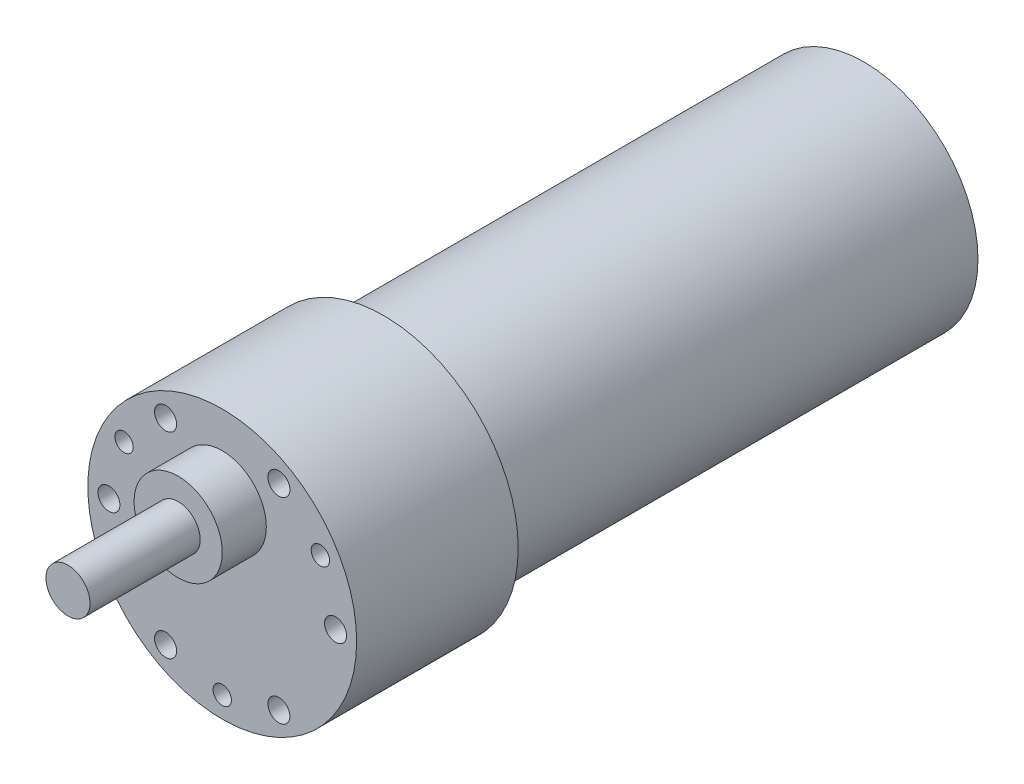
ISO-10303-21;
HEADER;
FILE_DESCRIPTION(('STEP AP214'),'2;1');
FILE_NAME('part.step','',(''),(''),'','','');
FILE_SCHEMA(('AUTOMOTIVE_DESIGN { 1 0 10303 214 1 1 1 1 }'));
ENDSEC;
DATA;
#1=APPLICATION_CONTEXT('core data for automotive mechanical design processes');
#2=APPLICATION_PROTOCOL_DEFINITION('international standard','automotive_design',2000,#1);
#3=PRODUCT_CONTEXT('',#1,'mechanical');
#4=PRODUCT('Part','Part','',(#3));
#5=PRODUCT_RELATED_PRODUCT_CATEGORY('part','',(#4));
#6=PRODUCT_DEFINITION_FORMATION('','',#4);
#7=PRODUCT_DEFINITION_CONTEXT('part definition',#1,'design');
#8=PRODUCT_DEFINITION('design','',#6,#7);
#9=PRODUCT_DEFINITION_SHAPE('','',#8);
#10=(LENGTH_UNIT() NAMED_UNIT(*) SI_UNIT(.MILLI.,.METRE.));
#11=(NAMED_UNIT(*) PLANE_ANGLE_UNIT() SI_UNIT($,.RADIAN.));
#12=(NAMED_UNIT(*) SI_UNIT($,.STERADIAN.) SOLID_ANGLE_UNIT());
#13=UNCERTAINTY_MEASURE_WITH_UNIT(LENGTH_MEASURE(1.E-05),#10,'distance_accuracy_value','');
#14=(GEOMETRIC_REPRESENTATION_CONTEXT(3) GLOBAL_UNCERTAINTY_ASSIGNED_CONTEXT((#13)) GLOBAL_UNIT_ASSIGNED_CONTEXT((#10,
#11,#12)) REPRESENTATION_CONTEXT('',''));
#15=CARTESIAN_POINT('',(0.,0.,0.));
#16=DIRECTION('',(0.,0.,1.));
#17=DIRECTION('',(1.,0.,0.));
#18=AXIS2_PLACEMENT_3D('',#15,#16,#17);
#19=CARTESIAN_POINT('',(0.,0.,65.4));
#20=DIRECTION('',(0.,0.,-1.));
#21=DIRECTION('',(-1.,0.,0.));
#22=AXIS2_PLACEMENT_3D('',#19,#20,#21);
#23=CYLINDRICAL_SURFACE('',#22,15.5);
#24=CARTESIAN_POINT('',(0.,0.,65.4));
#25=DIRECTION('',(0.,0.,1.));
#26=DIRECTION('',(1.,0.,0.));
#27=AXIS2_PLACEMENT_3D('',#24,#25,#26);
#28=CIRCLE('',#27,15.5);
#29=CARTESIAN_POINT('',(15.5,0.,65.4));
#30=VERTEX_POINT('',#29);
#31=EDGE_CURVE('E51',#30,#30,#28,.T.);
#32=ORIENTED_EDGE('',*,*,#31,.F.);
#33=EDGE_LOOP('',(#32));
#34=FACE_BOUND('',#33,.T.);
#35=CARTESIAN_POINT('',(0.,0.,0.));
#36=DIRECTION('',(0.,0.,1.));
#37=DIRECTION('',(1.,0.,0.));
#38=AXIS2_PLACEMENT_3D('',#35,#36,#37);
#39=CIRCLE('',#38,15.5);
#40=CARTESIAN_POINT('',(15.5,0.,0.));
#41=VERTEX_POINT('',#40);
#42=EDGE_CURVE('E40',#41,#41,#39,.T.);
#43=ORIENTED_EDGE('',*,*,#42,.T.);
#44=EDGE_LOOP('',(#43));
#45=FACE_BOUND('',#44,.T.);
#46=ADVANCED_FACE('F37',(#34,#45),#23,.T.);
#47=CARTESIAN_POINT('',(0.,0.,0.));
#48=DIRECTION('',(0.,0.,1.));
#49=DIRECTION('',(1.,0.,0.));
#50=AXIS2_PLACEMENT_3D('',#47,#48,#49);
#51=PLANE('',#50);
#52=CARTESIAN_POINT('',(0.,0.,0.));
#53=DIRECTION('',(0.,0.,-1.));
#54=DIRECTION('',(-1.,0.,0.));
#55=AXIS2_PLACEMENT_3D('',#52,#53,#54);
#56=CIRCLE('',#55,6.);
#57=CARTESIAN_POINT('',(-6.,0.,0.));
#58=VERTEX_POINT('',#57);
#59=EDGE_CURVE('E45',#58,#58,#56,.T.);
#60=ORIENTED_EDGE('',*,*,#59,.F.);
#61=EDGE_LOOP('',(#60));
#62=FACE_BOUND('',#61,.T.);
#63=ORIENTED_EDGE('',*,*,#42,.F.);
#64=EDGE_LOOP('',(#63));
#65=FACE_BOUND('',#64,.T.);
#66=ADVANCED_FACE('F156',(#62,#65),#51,.F.);
#67=CARTESIAN_POINT('',(0.,0.,-2.));
#68=DIRECTION('',(0.,0.,1.));
#69=DIRECTION('',(1.,0.,0.));
#70=AXIS2_PLACEMENT_3D('',#67,#68,#69);
#71=CYLINDRICAL_SURFACE('',#70,6.);
#72=CARTESIAN_POINT('',(0.,0.,-2.));
#73=DIRECTION('',(0.,0.,-1.));
#74=DIRECTION('',(-1.,0.,0.));
#75=AXIS2_PLACEMENT_3D('',#72,#73,#74);
#76=CIRCLE('',#75,6.);
#77=CARTESIAN_POINT('',(-6.,0.,-2.));
#78=VERTEX_POINT('',#77);
#79=EDGE_CURVE('E141',#78,#78,#76,.T.);
#80=ORIENTED_EDGE('',*,*,#79,.F.);
#81=EDGE_LOOP('',(#80));
#82=FACE_BOUND('',#81,.T.);
#83=ORIENTED_EDGE('',*,*,#59,.T.);
#84=EDGE_LOOP('',(#83));
#85=FACE_BOUND('',#84,.T.);
#86=ADVANCED_FACE('F158',(#82,#85),#71,.T.);
#87=CARTESIAN_POINT('',(0.,0.,-2.));
#88=DIRECTION('',(0.,0.,-1.));
#89=DIRECTION('',(-1.,0.,0.));
#90=AXIS2_PLACEMENT_3D('',#87,#88,#89);
#91=PLANE('',#90);
#92=ORIENTED_EDGE('',*,*,#79,.T.);
#93=EDGE_LOOP('',(#92));
#94=FACE_BOUND('',#93,.T.);
#95=ADVANCED_FACE('F164',(#94),#91,.T.);
#96=CARTESIAN_POINT('',(0.,0.,87.4));
#97=DIRECTION('',(0.,0.,-1.));
#98=DIRECTION('',(-1.,0.,0.));
#99=AXIS2_PLACEMENT_3D('',#96,#97,#98);
#100=CYLINDRICAL_SURFACE('',#99,18.3);
#101=CARTESIAN_POINT('',(0.,0.,87.4));
#102=DIRECTION('',(0.,0.,1.));
#103=DIRECTION('',(1.,0.,0.));
#104=AXIS2_PLACEMENT_3D('',#101,#102,#103);
#105=CIRCLE('',#104,18.3);
#106=CARTESIAN_POINT('',(18.3,0.,87.4));
#107=VERTEX_POINT('',#106);
#108=EDGE_CURVE('E137',#107,#107,#105,.T.);
#109=ORIENTED_EDGE('',*,*,#108,.F.);
#110=EDGE_LOOP('',(#109));
#111=FACE_BOUND('',#110,.T.);
#112=CARTESIAN_POINT('',(0.,0.,65.4));
#113=DIRECTION('',(0.,0.,1.));
#114=DIRECTION('',(1.,0.,0.));
#115=AXIS2_PLACEMENT_3D('',#112,#113,#114);
#116=CIRCLE('',#115,18.3);
#117=CARTESIAN_POINT('',(18.3,0.,65.4));
#118=VERTEX_POINT('',#117);
#119=EDGE_CURVE('E93',#118,#118,#116,.T.);
#120=ORIENTED_EDGE('',*,*,#119,.T.);
#121=EDGE_LOOP('',(#120));
#122=FACE_BOUND('',#121,.T.);
#123=ADVANCED_FACE('F172',(#111,#122),#100,.T.);
#124=CARTESIAN_POINT('',(0.,0.,87.4));
#125=DIRECTION('',(0.,0.,1.));
#126=DIRECTION('',(1.,0.,0.));
#127=AXIS2_PLACEMENT_3D('',#124,#125,#126);
#128=PLANE('',#127);
#129=CARTESIAN_POINT('',(0.,7.37,87.4));
#130=DIRECTION('',(0.,0.,1.));
#131=DIRECTION('',(1.,0.,0.));
#132=AXIS2_PLACEMENT_3D('',#129,#130,#131);
#133=CIRCLE('',#132,6.);
#134=CARTESIAN_POINT('',(6.,7.37,87.4));
#135=VERTEX_POINT('',#134);
#136=EDGE_CURVE('E61',#135,#135,#133,.T.);
#137=ORIENTED_EDGE('',*,*,#136,.F.);
#138=EDGE_LOOP('',(#137));
#139=FACE_BOUND('',#138,.T.);
#140=CARTESIAN_POINT('',(0.,-15.43,87.4));
#141=DIRECTION('',(0.,0.,1.));
#142=DIRECTION('',(1.,0.,0.));
#143=AXIS2_PLACEMENT_3D('',#140,#141,#142);
#144=CIRCLE('',#143,1.25);
#145=CARTESIAN_POINT('',(1.25,-15.43,87.4));
#146=VERTEX_POINT('',#145);
#147=EDGE_CURVE('E70',#146,#146,#144,.T.);
#148=ORIENTED_EDGE('',*,*,#147,.F.);
#149=EDGE_LOOP('',(#148));
#150=FACE_BOUND('',#149,.T.);
#151=CARTESIAN_POINT('',(-13.3627719803939,7.71500000000007,87.4));
#152=DIRECTION('',(0.,0.,1.));
#153=DIRECTION('',(1.,0.,0.));
#154=AXIS2_PLACEMENT_3D('',#151,#152,#153);
#155=CIRCLE('',#154,1.25);
#156=CARTESIAN_POINT('',(-12.1127719803939,7.71500000000007,87.4));
#157=VERTEX_POINT('',#156);
#158=EDGE_CURVE('E74',#157,#157,#155,.T.);
#159=ORIENTED_EDGE('',*,*,#158,.F.);
#160=EDGE_LOOP('',(#159));
#161=FACE_BOUND('',#160,.T.);
#162=CARTESIAN_POINT('',(13.362771980394,7.71499999999988,87.4));
#163=DIRECTION('',(0.,0.,1.));
#164=DIRECTION('',(1.,0.,0.));
#165=AXIS2_PLACEMENT_3D('',#162,#163,#164);
#166=CIRCLE('',#165,1.25);
#167=CARTESIAN_POINT('',(14.612771980394,7.71499999999988,87.4));
#168=VERTEX_POINT('',#167);
#169=EDGE_CURVE('E82',#168,#168,#166,.T.);
#170=ORIENTED_EDGE('',*,*,#169,.F.);
#171=EDGE_LOOP('',(#170));
#172=FACE_BOUND('',#171,.T.);
#173=CARTESIAN_POINT('',(-15.43,0.,87.4));
#174=DIRECTION('',(0.,0.,1.));
#175=DIRECTION('',(1.,0.,0.));
#176=AXIS2_PLACEMENT_3D('',#173,#174,#175);
#177=CIRCLE('',#176,1.5);
#178=CARTESIAN_POINT('',(-13.93,0.,87.4));
#179=VERTEX_POINT('',#178);
#180=EDGE_CURVE('E94',#179,#179,#177,.T.);
#181=ORIENTED_EDGE('',*,*,#180,.F.);
#182=EDGE_LOOP('',(#181));
#183=FACE_BOUND('',#182,.T.);
#184=CARTESIAN_POINT('',(7.71499999999988,-13.362771980394,87.4));
#185=DIRECTION('',(0.,0.,1.));
#186=DIRECTION('',(1.,0.,0.));
#187=AXIS2_PLACEMENT_3D('',#184,#185,#186);
#188=CIRCLE('',#187,1.5);
#189=CARTESIAN_POINT('',(9.21499999999988,-13.362771980394,87.4));
#190=VERTEX_POINT('',#189);
#191=EDGE_CURVE('E69',#190,#190,#188,.T.);
#192=ORIENTED_EDGE('',*,*,#191,.F.);
#193=EDGE_LOOP('',(#192));
#194=FACE_BOUND('',#193,.T.);
#195=CARTESIAN_POINT('',(-7.71500000000016,-13.3627719803938,87.4));
#196=DIRECTION('',(0.,0.,1.));
#197=DIRECTION('',(1.,0.,0.));
#198=AXIS2_PLACEMENT_3D('',#195,#196,#197);
#199=CIRCLE('',#198,1.5);
#200=CARTESIAN_POINT('',(-6.21500000000016,-13.3627719803938,87.4));
#201=VERTEX_POINT('',#200);
#202=EDGE_CURVE('E103',#201,#201,#199,.T.);
#203=ORIENTED_EDGE('',*,*,#202,.F.);
#204=EDGE_LOOP('',(#203));
#205=FACE_BOUND('',#204,.T.);
#206=CARTESIAN_POINT('',(15.43,-1.07747114116699E-13,87.4));
#207=DIRECTION('',(0.,0.,1.));
#208=DIRECTION('',(1.,0.,0.));
#209=AXIS2_PLACEMENT_3D('',#206,#207,#208);
#210=CIRCLE('',#209,1.5);
#211=CARTESIAN_POINT('',(16.93,-1.07747114116699E-13,87.4));
#212=VERTEX_POINT('',#211);
#213=EDGE_CURVE('E126',#212,#212,#210,.T.);
#214=ORIENTED_EDGE('',*,*,#213,.F.);
#215=EDGE_LOOP('',(#214));
#216=FACE_BOUND('',#215,.T.);
#217=CARTESIAN_POINT('',(7.71500000000006,13.3627719803939,87.4));
#218=DIRECTION('',(0.,0.,1.));
#219=DIRECTION('',(1.,0.,0.));
#220=AXIS2_PLACEMENT_3D('',#217,#218,#219);
#221=CIRCLE('',#220,1.5);
#222=CARTESIAN_POINT('',(9.21500000000006,13.3627719803939,87.4));
#223=VERTEX_POINT('',#222);
#224=EDGE_CURVE('E118',#223,#223,#221,.T.);
#225=ORIENTED_EDGE('',*,*,#224,.F.);
#226=EDGE_LOOP('',(#225));
#227=FACE_BOUND('',#226,.T.);
#228=CARTESIAN_POINT('',(-7.71499999999997,13.3627719803939,87.4));
#229=DIRECTION('',(0.,0.,1.));
#230=DIRECTION('',(1.,0.,0.));
#231=AXIS2_PLACEMENT_3D('',#228,#229,#230);
#232=CIRCLE('',#231,1.5);
#233=CARTESIAN_POINT('',(-6.21499999999997,13.3627719803939,87.4));
#234=VERTEX_POINT('',#233);
#235=EDGE_CURVE('E110',#234,#234,#232,.T.);
#236=ORIENTED_EDGE('',*,*,#235,.F.);
#237=EDGE_LOOP('',(#236));
#238=FACE_BOUND('',#237,.T.);
#239=ORIENTED_EDGE('',*,*,#108,.T.);
#240=EDGE_LOOP('',(#239));
#241=FACE_BOUND('',#240,.T.);
#242=ADVANCED_FACE('F176',(#139,#150,#161,#172,#183,#194,#205,#216,#227,#238,#241),#128,.T.);
#243=CARTESIAN_POINT('',(0.,0.,65.4));
#244=DIRECTION('',(0.,0.,1.));
#245=DIRECTION('',(1.,0.,0.));
#246=AXIS2_PLACEMENT_3D('',#243,#244,#245);
#247=PLANE('',#246);
#248=ORIENTED_EDGE('',*,*,#31,.T.);
#249=EDGE_LOOP('',(#248));
#250=FACE_BOUND('',#249,.T.);
#251=ORIENTED_EDGE('',*,*,#119,.F.);
#252=EDGE_LOOP('',(#251));
#253=FACE_BOUND('',#252,.T.);
#254=ADVANCED_FACE('F178',(#250,#253),#247,.F.);
#255=CARTESIAN_POINT('',(-7.71499999999997,13.3627719803939,67.4));
#256=DIRECTION('',(0.,0.,1.));
#257=DIRECTION('',(1.,0.,0.));
#258=AXIS2_PLACEMENT_3D('',#255,#256,#257);
#259=CYLINDRICAL_SURFACE('',#258,1.5);
#260=CARTESIAN_POINT('',(-7.71499999999997,13.3627719803939,67.4));
#261=DIRECTION('',(0.,0.,1.));
#262=DIRECTION('',(1.,0.,0.));
#263=AXIS2_PLACEMENT_3D('',#260,#261,#262);
#264=CIRCLE('',#263,1.5);
#265=CARTESIAN_POINT('',(-6.21499999999997,13.3627719803939,67.4));
#266=VERTEX_POINT('',#265);
#267=EDGE_CURVE('E98',#266,#266,#264,.T.);
#268=ORIENTED_EDGE('',*,*,#267,.F.);
#269=EDGE_LOOP('',(#268));
#270=FACE_BOUND('',#269,.T.);
#271=ORIENTED_EDGE('',*,*,#235,.T.);
#272=EDGE_LOOP('',(#271));
#273=FACE_BOUND('',#272,.T.);
#274=ADVANCED_FACE('F181',(#270,#273),#259,.F.);
#275=CARTESIAN_POINT('',(0.,0.,67.4));
#276=DIRECTION('',(0.,0.,1.));
#277=DIRECTION('',(1.,0.,0.));
#278=AXIS2_PLACEMENT_3D('',#275,#276,#277);
#279=PLANE('',#278);
#280=ORIENTED_EDGE('',*,*,#267,.T.);
#281=EDGE_LOOP('',(#280));
#282=FACE_BOUND('',#281,.T.);
#283=ADVANCED_FACE('F206',(#282),#279,.T.);
#284=CARTESIAN_POINT('',(7.71500000000006,13.3627719803939,67.4));
#285=DIRECTION('',(0.,0.,1.));
#286=DIRECTION('',(1.,0.,0.));
#287=AXIS2_PLACEMENT_3D('',#284,#285,#286);
#288=CYLINDRICAL_SURFACE('',#287,1.5);
#289=CARTESIAN_POINT('',(7.71500000000006,13.3627719803939,67.4));
#290=DIRECTION('',(0.,0.,1.));
#291=DIRECTION('',(1.,0.,0.));
#292=AXIS2_PLACEMENT_3D('',#289,#290,#291);
#293=CIRCLE('',#292,1.5);
#294=CARTESIAN_POINT('',(9.21500000000006,13.3627719803939,67.4));
#295=VERTEX_POINT('',#294);
#296=EDGE_CURVE('E114',#295,#295,#293,.T.);
#297=ORIENTED_EDGE('',*,*,#296,.F.);
#298=EDGE_LOOP('',(#297));
#299=FACE_BOUND('',#298,.T.);
#300=ORIENTED_EDGE('',*,*,#224,.T.);
#301=EDGE_LOOP('',(#300));
#302=FACE_BOUND('',#301,.T.);
#303=ADVANCED_FACE('F203',(#299,#302),#288,.F.);
#304=CARTESIAN_POINT('',(0.,0.,67.4));
#305=DIRECTION('',(0.,0.,1.));
#306=DIRECTION('',(1.,0.,0.));
#307=AXIS2_PLACEMENT_3D('',#304,#305,#306);
#308=PLANE('',#307);
#309=ORIENTED_EDGE('',*,*,#296,.T.);
#310=EDGE_LOOP('',(#309));
#311=FACE_BOUND('',#310,.T.);
#312=ADVANCED_FACE('F198',(#311),#308,.T.);
#313=CARTESIAN_POINT('',(15.43,-1.07747114116699E-13,67.4));
#314=DIRECTION('',(0.,0.,1.));
#315=DIRECTION('',(1.,0.,0.));
#316=AXIS2_PLACEMENT_3D('',#313,#314,#315);
#317=CYLINDRICAL_SURFACE('',#316,1.5);
#318=CARTESIAN_POINT('',(15.43,-1.07747114116699E-13,67.4));
#319=DIRECTION('',(0.,0.,1.));
#320=DIRECTION('',(1.,0.,0.));
#321=AXIS2_PLACEMENT_3D('',#318,#319,#320);
#322=CIRCLE('',#321,1.5);
#323=CARTESIAN_POINT('',(16.93,-1.07747114116699E-13,67.4));
#324=VERTEX_POINT('',#323);
#325=EDGE_CURVE('E122',#324,#324,#322,.T.);
#326=ORIENTED_EDGE('',*,*,#325,.F.);
#327=EDGE_LOOP('',(#326));
#328=FACE_BOUND('',#327,.T.);
#329=ORIENTED_EDGE('',*,*,#213,.T.);
#330=EDGE_LOOP('',(#329));
#331=FACE_BOUND('',#330,.T.);
#332=ADVANCED_FACE('F195',(#328,#331),#317,.F.);
#333=CARTESIAN_POINT('',(0.,0.,67.4));
#334=DIRECTION('',(0.,0.,1.));
#335=DIRECTION('',(1.,0.,0.));
#336=AXIS2_PLACEMENT_3D('',#333,#334,#335);
#337=PLANE('',#336);
#338=ORIENTED_EDGE('',*,*,#325,.T.);
#339=EDGE_LOOP('',(#338));
#340=FACE_BOUND('',#339,.T.);
#341=ADVANCED_FACE('F189',(#340),#337,.T.);
#342=CARTESIAN_POINT('',(-7.71500000000016,-13.3627719803938,67.4));
#343=DIRECTION('',(0.,0.,1.));
#344=DIRECTION('',(1.,0.,0.));
#345=AXIS2_PLACEMENT_3D('',#342,#343,#344);
#346=CYLINDRICAL_SURFACE('',#345,1.5);
#347=CARTESIAN_POINT('',(-7.71500000000016,-13.3627719803938,67.4));
#348=DIRECTION('',(0.,0.,1.));
#349=DIRECTION('',(1.,0.,0.));
#350=AXIS2_PLACEMENT_3D('',#347,#348,#349);
#351=CIRCLE('',#350,1.5);
#352=CARTESIAN_POINT('',(-6.21500000000016,-13.3627719803938,67.4));
#353=VERTEX_POINT('',#352);
#354=EDGE_CURVE('E130',#353,#353,#351,.T.);
#355=ORIENTED_EDGE('',*,*,#354,.F.);
#356=EDGE_LOOP('',(#355));
#357=FACE_BOUND('',#356,.T.);
#358=ORIENTED_EDGE('',*,*,#202,.T.);
#359=EDGE_LOOP('',(#358));
#360=FACE_BOUND('',#359,.T.);
#361=ADVANCED_FACE('F185',(#357,#360),#346,.F.);
#362=CARTESIAN_POINT('',(0.,0.,67.4));
#363=DIRECTION('',(0.,0.,1.));
#364=DIRECTION('',(1.,0.,0.));
#365=AXIS2_PLACEMENT_3D('',#362,#363,#364);
#366=PLANE('',#365);
#367=ORIENTED_EDGE('',*,*,#354,.T.);
#368=EDGE_LOOP('',(#367));
#369=FACE_BOUND('',#368,.T.);
#370=ADVANCED_FACE('F188',(#369),#366,.T.);
#371=CARTESIAN_POINT('',(7.71499999999988,-13.362771980394,67.4));
#372=DIRECTION('',(0.,0.,1.));
#373=DIRECTION('',(1.,0.,0.));
#374=AXIS2_PLACEMENT_3D('',#371,#372,#373);
#375=CYLINDRICAL_SURFACE('',#374,1.5);
#376=CARTESIAN_POINT('',(7.71499999999988,-13.362771980394,67.4));
#377=DIRECTION('',(0.,0.,1.));
#378=DIRECTION('',(1.,0.,0.));
#379=AXIS2_PLACEMENT_3D('',#376,#377,#378);
#380=CIRCLE('',#379,1.5);
#381=CARTESIAN_POINT('',(9.21499999999988,-13.362771980394,67.4));
#382=VERTEX_POINT('',#381);
#383=EDGE_CURVE('E99',#382,#382,#380,.T.);
#384=ORIENTED_EDGE('',*,*,#383,.F.);
#385=EDGE_LOOP('',(#384));
#386=FACE_BOUND('',#385,.T.);
#387=ORIENTED_EDGE('',*,*,#191,.T.);
#388=EDGE_LOOP('',(#387));
#389=FACE_BOUND('',#388,.T.);
#390=ADVANCED_FACE('F193',(#386,#389),#375,.F.);
#391=CARTESIAN_POINT('',(0.,0.,67.4));
#392=DIRECTION('',(0.,0.,1.));
#393=DIRECTION('',(1.,0.,0.));
#394=AXIS2_PLACEMENT_3D('',#391,#392,#393);
#395=PLANE('',#394);
#396=ORIENTED_EDGE('',*,*,#383,.T.);
#397=EDGE_LOOP('',(#396));
#398=FACE_BOUND('',#397,.T.);
#399=ADVANCED_FACE('F219',(#398),#395,.T.);
#400=CARTESIAN_POINT('',(-15.43,0.,67.4));
#401=DIRECTION('',(0.,0.,1.));
#402=DIRECTION('',(1.,0.,0.));
#403=AXIS2_PLACEMENT_3D('',#400,#401,#402);
#404=CYLINDRICAL_SURFACE('',#403,1.5);
#405=CARTESIAN_POINT('',(-15.43,0.,67.4));
#406=DIRECTION('',(0.,0.,1.));
#407=DIRECTION('',(1.,0.,0.));
#408=AXIS2_PLACEMENT_3D('',#405,#406,#407);
#409=CIRCLE('',#408,1.5);
#410=CARTESIAN_POINT('',(-13.93,0.,67.4));
#411=VERTEX_POINT('',#410);
#412=EDGE_CURVE('E89',#411,#411,#409,.T.);
#413=ORIENTED_EDGE('',*,*,#412,.F.);
#414=EDGE_LOOP('',(#413));
#415=FACE_BOUND('',#414,.T.);
#416=ORIENTED_EDGE('',*,*,#180,.T.);
#417=EDGE_LOOP('',(#416));
#418=FACE_BOUND('',#417,.T.);
#419=ADVANCED_FACE('F223',(#415,#418),#404,.F.);
#420=CARTESIAN_POINT('',(0.,0.,67.4));
#421=DIRECTION('',(0.,0.,1.));
#422=DIRECTION('',(1.,0.,0.));
#423=AXIS2_PLACEMENT_3D('',#420,#421,#422);
#424=PLANE('',#423);
#425=ORIENTED_EDGE('',*,*,#412,.T.);
#426=EDGE_LOOP('',(#425));
#427=FACE_BOUND('',#426,.T.);
#428=ADVANCED_FACE('F227',(#427),#424,.T.);
#429=CARTESIAN_POINT('',(13.362771980394,7.71499999999988,67.4));
#430=DIRECTION('',(0.,0.,1.));
#431=DIRECTION('',(1.,0.,0.));
#432=AXIS2_PLACEMENT_3D('',#429,#430,#431);
#433=CYLINDRICAL_SURFACE('',#432,1.25);
#434=CARTESIAN_POINT('',(13.362771980394,7.71499999999988,67.4));
#435=DIRECTION('',(0.,0.,1.));
#436=DIRECTION('',(1.,0.,0.));
#437=AXIS2_PLACEMENT_3D('',#434,#435,#436);
#438=CIRCLE('',#437,1.25);
#439=CARTESIAN_POINT('',(14.612771980394,7.71499999999988,67.4));
#440=VERTEX_POINT('',#439);
#441=EDGE_CURVE('E60',#440,#440,#438,.T.);
#442=ORIENTED_EDGE('',*,*,#441,.F.);
#443=EDGE_LOOP('',(#442));
#444=FACE_BOUND('',#443,.T.);
#445=ORIENTED_EDGE('',*,*,#169,.T.);
#446=EDGE_LOOP('',(#445));
#447=FACE_BOUND('',#446,.T.);
#448=ADVANCED_FACE('F231',(#444,#447),#433,.F.);
#449=CARTESIAN_POINT('',(13.362771980394,7.71499999999988,67.4));
#450=DIRECTION('',(0.,0.,1.));
#451=DIRECTION('',(1.,0.,0.));
#452=AXIS2_PLACEMENT_3D('',#449,#450,#451);
#453=PLANE('',#452);
#454=ORIENTED_EDGE('',*,*,#441,.T.);
#455=EDGE_LOOP('',(#454));
#456=FACE_BOUND('',#455,.T.);
#457=ADVANCED_FACE('F233',(#456),#453,.T.);
#458=CARTESIAN_POINT('',(-13.3627719803939,7.71500000000007,67.4));
#459=DIRECTION('',(0.,0.,1.));
#460=DIRECTION('',(1.,0.,0.));
#461=AXIS2_PLACEMENT_3D('',#458,#459,#460);
#462=CYLINDRICAL_SURFACE('',#461,1.25);
#463=CARTESIAN_POINT('',(-13.3627719803939,7.71500000000007,67.4));
#464=DIRECTION('',(0.,0.,1.));
#465=DIRECTION('',(1.,0.,0.));
#466=AXIS2_PLACEMENT_3D('',#463,#464,#465);
#467=CIRCLE('',#466,1.25);
#468=CARTESIAN_POINT('',(-12.1127719803939,7.71500000000007,67.4));
#469=VERTEX_POINT('',#468);
#470=EDGE_CURVE('E78',#469,#469,#467,.T.);
#471=ORIENTED_EDGE('',*,*,#470,.F.);
#472=EDGE_LOOP('',(#471));
#473=FACE_BOUND('',#472,.T.);
#474=ORIENTED_EDGE('',*,*,#158,.T.);
#475=EDGE_LOOP('',(#474));
#476=FACE_BOUND('',#475,.T.);
#477=ADVANCED_FACE('F236',(#473,#476),#462,.F.);
#478=CARTESIAN_POINT('',(-13.3627719803939,7.71500000000007,67.4));
#479=DIRECTION('',(0.,0.,1.));
#480=DIRECTION('',(1.,0.,0.));
#481=AXIS2_PLACEMENT_3D('',#478,#479,#480);
#482=PLANE('',#481);
#483=ORIENTED_EDGE('',*,*,#470,.T.);
#484=EDGE_LOOP('',(#483));
#485=FACE_BOUND('',#484,.T.);
#486=ADVANCED_FACE('F241',(#485),#482,.T.);
#487=CARTESIAN_POINT('',(0.,-15.43,67.4));
#488=DIRECTION('',(0.,0.,1.));
#489=DIRECTION('',(1.,0.,0.));
#490=AXIS2_PLACEMENT_3D('',#487,#488,#489);
#491=CYLINDRICAL_SURFACE('',#490,1.25);
#492=CARTESIAN_POINT('',(0.,-15.43,67.4));
#493=DIRECTION('',(0.,0.,1.));
#494=DIRECTION('',(1.,0.,0.));
#495=AXIS2_PLACEMENT_3D('',#492,#493,#494);
#496=CIRCLE('',#495,1.25);
#497=CARTESIAN_POINT('',(1.25,-15.43,67.4));
#498=VERTEX_POINT('',#497);
#499=EDGE_CURVE('E65',#498,#498,#496,.T.);
#500=ORIENTED_EDGE('',*,*,#499,.F.);
#501=EDGE_LOOP('',(#500));
#502=FACE_BOUND('',#501,.T.);
#503=ORIENTED_EDGE('',*,*,#147,.T.);
#504=EDGE_LOOP('',(#503));
#505=FACE_BOUND('',#504,.T.);
#506=ADVANCED_FACE('F244',(#502,#505),#491,.F.);
#507=CARTESIAN_POINT('',(0.,-15.43,67.4));
#508=DIRECTION('',(0.,0.,1.));
#509=DIRECTION('',(1.,0.,0.));
#510=AXIS2_PLACEMENT_3D('',#507,#508,#509);
#511=PLANE('',#510);
#512=ORIENTED_EDGE('',*,*,#499,.T.);
#513=EDGE_LOOP('',(#512));
#514=FACE_BOUND('',#513,.T.);
#515=ADVANCED_FACE('F251',(#514),#511,.T.);
#516=CARTESIAN_POINT('',(0.,7.37,93.4));
#517=DIRECTION('',(0.,0.,-1.));
#518=DIRECTION('',(-1.,0.,0.));
#519=AXIS2_PLACEMENT_3D('',#516,#517,#518);
#520=CYLINDRICAL_SURFACE('',#519,6.);
#521=CARTESIAN_POINT('',(0.,7.37,93.4));
#522=DIRECTION('',(0.,0.,1.));
#523=DIRECTION('',(1.,0.,0.));
#524=AXIS2_PLACEMENT_3D('',#521,#522,#523);
#525=CIRCLE('',#524,6.);
#526=CARTESIAN_POINT('',(6.,7.37,93.4));
#527=VERTEX_POINT('',#526);
#528=EDGE_CURVE('E56',#527,#527,#525,.T.);
#529=ORIENTED_EDGE('',*,*,#528,.F.);
#530=EDGE_LOOP('',(#529));
#531=FACE_BOUND('',#530,.T.);
#532=ORIENTED_EDGE('',*,*,#136,.T.);
#533=EDGE_LOOP('',(#532));
#534=FACE_BOUND('',#533,.T.);
#535=ADVANCED_FACE('F255',(#531,#534),#520,.T.);
#536=CARTESIAN_POINT('',(0.,7.37,93.4));
#537=DIRECTION('',(0.,0.,1.));
#538=DIRECTION('',(1.,0.,0.));
#539=AXIS2_PLACEMENT_3D('',#536,#537,#538);
#540=PLANE('',#539);
#541=CARTESIAN_POINT('',(0.,7.37,93.4));
#542=DIRECTION('',(0.,0.,1.));
#543=DIRECTION('',(1.,0.,0.));
#544=AXIS2_PLACEMENT_3D('',#541,#542,#543);
#545=CIRCLE('',#544,3.);
#546=CARTESIAN_POINT('',(3.,7.37,93.4));
#547=VERTEX_POINT('',#546);
#548=EDGE_CURVE('E10',#547,#547,#545,.T.);
#549=ORIENTED_EDGE('',*,*,#548,.F.);
#550=EDGE_LOOP('',(#549));
#551=FACE_BOUND('',#550,.T.);
#552=ORIENTED_EDGE('',*,*,#528,.T.);
#553=EDGE_LOOP('',(#552));
#554=FACE_BOUND('',#553,.T.);
#555=ADVANCED_FACE('F259',(#551,#554),#540,.T.);
#556=CARTESIAN_POINT('',(0.,7.37,108.4));
#557=DIRECTION('',(0.,0.,-1.));
#558=DIRECTION('',(-1.,0.,0.));
#559=AXIS2_PLACEMENT_3D('',#556,#557,#558);
#560=CYLINDRICAL_SURFACE('',#559,3.);
#561=CARTESIAN_POINT('',(0.,7.37,108.4));
#562=DIRECTION('',(0.,0.,1.));
#563=DIRECTION('',(1.,0.,0.));
#564=AXIS2_PLACEMENT_3D('',#561,#562,#563);
#565=CIRCLE('',#564,3.);
#566=CARTESIAN_POINT('',(3.,7.37,108.4));
#567=VERTEX_POINT('',#566);
#568=EDGE_CURVE('E55',#567,#567,#565,.T.);
#569=ORIENTED_EDGE('',*,*,#568,.F.);
#570=EDGE_LOOP('',(#569));
#571=FACE_BOUND('',#570,.T.);
#572=ORIENTED_EDGE('',*,*,#548,.T.);
#573=EDGE_LOOP('',(#572));
#574=FACE_BOUND('',#573,.T.);
#575=ADVANCED_FACE('F263',(#571,#574),#560,.T.);
#576=CARTESIAN_POINT('',(0.,7.37,108.4));
#577=DIRECTION('',(0.,0.,1.));
#578=DIRECTION('',(1.,0.,0.));
#579=AXIS2_PLACEMENT_3D('',#576,#577,#578);
#580=PLANE('',#579);
#581=ORIENTED_EDGE('',*,*,#568,.T.);
#582=EDGE_LOOP('',(#581));
#583=FACE_BOUND('',#582,.T.);
#584=ADVANCED_FACE('F267',(#583),#580,.T.);
#585=CLOSED_SHELL('',(#46,#66,#86,#95,#123,#242,#254,#274,#283,#303,#312,#332,#341,#361,#370,
#390,#399,#419,#428,#448,#457,#477,#486,#506,#515,#535,#555,#575,#584));
#586=MANIFOLD_SOLID_BREP('B2',#585);
#587=ADVANCED_BREP_SHAPE_REPRESENTATION('',(#18,#586),#14);
#588=SHAPE_DEFINITION_REPRESENTATION(#9,#587);
ENDSEC;
END-ISO-10303-21;
